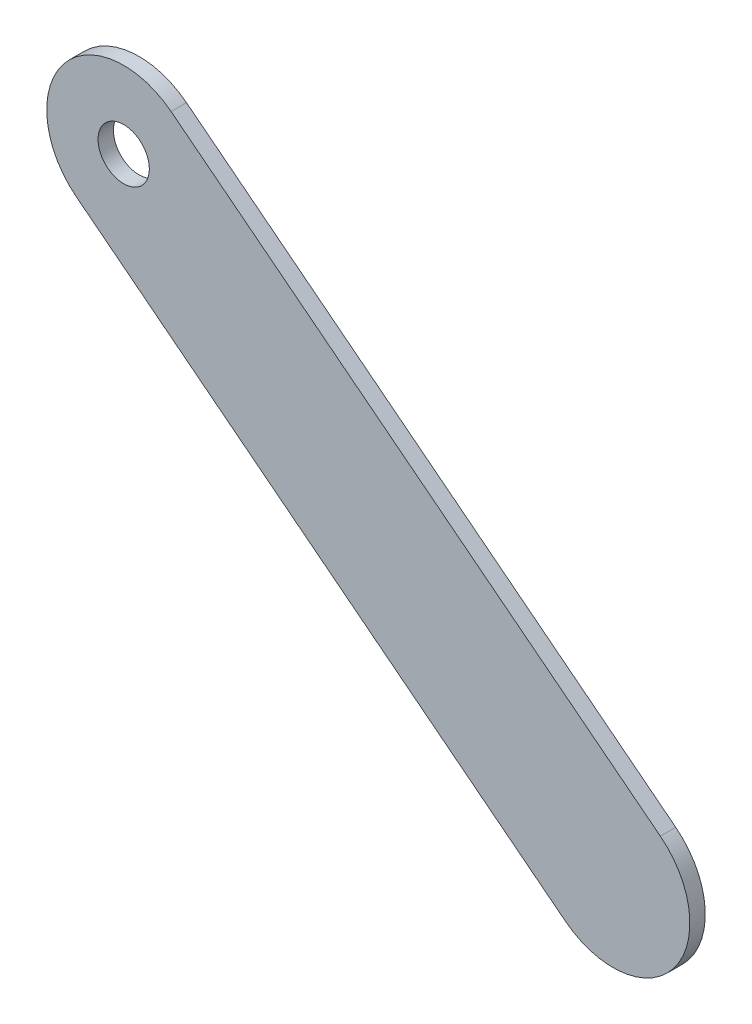
ISO-10303-21;
HEADER;
FILE_DESCRIPTION(('STEP AP214'),'2;1');
FILE_NAME('part.step','',(''),(''),'','','');
FILE_SCHEMA(('AUTOMOTIVE_DESIGN { 1 0 10303 214 1 1 1 1 }'));
ENDSEC;
DATA;
#1=APPLICATION_CONTEXT('core data for automotive mechanical design processes');
#2=APPLICATION_PROTOCOL_DEFINITION('international standard','automotive_design',2000,#1);
#3=PRODUCT_CONTEXT('',#1,'mechanical');
#4=PRODUCT('Part','Part','',(#3));
#5=PRODUCT_RELATED_PRODUCT_CATEGORY('part','',(#4));
#6=PRODUCT_DEFINITION_FORMATION('','',#4);
#7=PRODUCT_DEFINITION_CONTEXT('part definition',#1,'design');
#8=PRODUCT_DEFINITION('design','',#6,#7);
#9=PRODUCT_DEFINITION_SHAPE('','',#8);
#10=(LENGTH_UNIT() NAMED_UNIT(*) SI_UNIT(.MILLI.,.METRE.));
#11=(NAMED_UNIT(*) PLANE_ANGLE_UNIT() SI_UNIT($,.RADIAN.));
#12=(NAMED_UNIT(*) SI_UNIT($,.STERADIAN.) SOLID_ANGLE_UNIT());
#13=UNCERTAINTY_MEASURE_WITH_UNIT(LENGTH_MEASURE(1.E-05),#10,'distance_accuracy_value','');
#14=(GEOMETRIC_REPRESENTATION_CONTEXT(3) GLOBAL_UNCERTAINTY_ASSIGNED_CONTEXT((#13)) GLOBAL_UNIT_ASSIGNED_CONTEXT((#10,
#11,#12)) REPRESENTATION_CONTEXT('',''));
#15=CARTESIAN_POINT('',(0.,0.,0.));
#16=DIRECTION('',(0.,0.,1.));
#17=DIRECTION('',(1.,0.,0.));
#18=AXIS2_PLACEMENT_3D('',#15,#16,#17);
#19=CARTESIAN_POINT('',(-95.3863974624524,74.6563150541683,1.5));
#20=DIRECTION('',(0.,0.,1.));
#21=DIRECTION('',(1.,0.,0.));
#22=AXIS2_PLACEMENT_3D('',#19,#20,#21);
#23=PLANE('',#22);
#24=CARTESIAN_POINT('',(-95.3863974624524,74.6563150541683,1.5));
#25=DIRECTION('',(0.,0.,1.));
#26=DIRECTION('',(1.,0.,0.));
#27=AXIS2_PLACEMENT_3D('',#24,#25,#26);
#28=CIRCLE('',#27,15.);
#29=CARTESIAN_POINT('',(-86.1413057702997,86.4685239756058,1.5));
#30=VERTEX_POINT('',#29);
#31=CARTESIAN_POINT('',(-104.631489154605,62.8441061327308,1.5));
#32=VERTEX_POINT('',#31);
#33=EDGE_CURVE('E86',#30,#32,#28,.T.);
#34=ORIENTED_EDGE('',*,*,#33,.T.);
#35=DIRECTION('',(0.787480594762502,-0.616339446143516,0.));
#36=VECTOR('',#35,1.);
#37=CARTESIAN_POINT('',(-104.631489154605,62.8441061327308,1.5));
#38=LINE('',#37,#36);
#39=CARTESIAN_POINT('',(-9.24509169215274,-11.8122089214375,1.5));
#40=VERTEX_POINT('',#39);
#41=EDGE_CURVE('E81',#32,#40,#38,.T.);
#42=ORIENTED_EDGE('',*,*,#41,.T.);
#43=CARTESIAN_POINT('',(0.,0.,1.5));
#44=DIRECTION('',(0.,0.,1.));
#45=DIRECTION('',(1.,0.,0.));
#46=AXIS2_PLACEMENT_3D('',#43,#44,#45);
#47=CIRCLE('',#46,15.);
#48=CARTESIAN_POINT('',(9.24509169215272,11.8122089214375,1.5));
#49=VERTEX_POINT('',#48);
#50=EDGE_CURVE('E84',#40,#49,#47,.T.);
#51=ORIENTED_EDGE('',*,*,#50,.T.);
#52=DIRECTION('',(-0.787480594762502,0.616339446143516,0.));
#53=VECTOR('',#52,1.);
#54=CARTESIAN_POINT('',(-86.1413057702997,86.4685239756058,1.5));
#55=LINE('',#54,#53);
#56=EDGE_CURVE('E51',#49,#30,#55,.T.);
#57=ORIENTED_EDGE('',*,*,#56,.T.);
#58=EDGE_LOOP('',(#34,#42,#51,#57));
#59=FACE_BOUND('',#58,.T.);
#60=CARTESIAN_POINT('',(-95.3863974624524,74.6563150541683,1.5));
#61=DIRECTION('',(0.,0.,1.));
#62=DIRECTION('',(1.,0.,0.));
#63=AXIS2_PLACEMENT_3D('',#60,#61,#62);
#64=CIRCLE('',#63,4.99999999999999);
#65=CARTESIAN_POINT('',(-90.3863974624524,74.6563150541683,1.5));
#66=VERTEX_POINT('',#65);
#67=EDGE_CURVE('E101',#66,#66,#64,.T.);
#68=ORIENTED_EDGE('',*,*,#67,.F.);
#69=EDGE_LOOP('',(#68));
#70=FACE_BOUND('',#69,.T.);
#71=ADVANCED_FACE('F34',(#59,#70),#23,.T.);
#72=CARTESIAN_POINT('',(-95.3863974624524,74.6563150541683,-1.5));
#73=DIRECTION('',(0.,0.,1.));
#74=DIRECTION('',(1.,0.,0.));
#75=AXIS2_PLACEMENT_3D('',#72,#73,#74);
#76=PLANE('',#75);
#77=CARTESIAN_POINT('',(-95.3863974624524,74.6563150541683,-1.5));
#78=DIRECTION('',(0.,0.,1.));
#79=DIRECTION('',(1.,0.,0.));
#80=AXIS2_PLACEMENT_3D('',#77,#78,#79);
#81=CIRCLE('',#80,15.);
#82=CARTESIAN_POINT('',(-86.1413057702997,86.4685239756058,-1.5));
#83=VERTEX_POINT('',#82);
#84=CARTESIAN_POINT('',(-104.631489154605,62.8441061327308,-1.5));
#85=VERTEX_POINT('',#84);
#86=EDGE_CURVE('E98',#83,#85,#81,.T.);
#87=ORIENTED_EDGE('',*,*,#86,.F.);
#88=DIRECTION('',(-0.787480594762502,0.616339446143516,0.));
#89=VECTOR('',#88,1.);
#90=CARTESIAN_POINT('',(-86.1413057702997,86.4685239756058,-1.5));
#91=LINE('',#90,#89);
#92=CARTESIAN_POINT('',(9.24509169215272,11.8122089214375,-1.5));
#93=VERTEX_POINT('',#92);
#94=EDGE_CURVE('E74',#93,#83,#91,.T.);
#95=ORIENTED_EDGE('',*,*,#94,.F.);
#96=CARTESIAN_POINT('',(0.,0.,-1.5));
#97=DIRECTION('',(0.,0.,1.));
#98=DIRECTION('',(1.,0.,0.));
#99=AXIS2_PLACEMENT_3D('',#96,#97,#98);
#100=CIRCLE('',#99,15.);
#101=CARTESIAN_POINT('',(-9.24509169215274,-11.8122089214375,-1.5));
#102=VERTEX_POINT('',#101);
#103=EDGE_CURVE('E68',#102,#93,#100,.T.);
#104=ORIENTED_EDGE('',*,*,#103,.F.);
#105=DIRECTION('',(0.787480594762502,-0.616339446143516,0.));
#106=VECTOR('',#105,1.);
#107=CARTESIAN_POINT('',(-104.631489154605,62.8441061327308,-1.5));
#108=LINE('',#107,#106);
#109=EDGE_CURVE('E90',#85,#102,#108,.T.);
#110=ORIENTED_EDGE('',*,*,#109,.F.);
#111=EDGE_LOOP('',(#87,#95,#104,#110));
#112=FACE_BOUND('',#111,.T.);
#113=CARTESIAN_POINT('',(-95.3863974624524,74.6563150541683,-1.5));
#114=DIRECTION('',(0.,0.,1.));
#115=DIRECTION('',(1.,0.,0.));
#116=AXIS2_PLACEMENT_3D('',#113,#114,#115);
#117=CIRCLE('',#116,4.99999999999999);
#118=CARTESIAN_POINT('',(-90.3863974624524,74.6563150541683,-1.5));
#119=VERTEX_POINT('',#118);
#120=EDGE_CURVE('E113',#119,#119,#117,.T.);
#121=ORIENTED_EDGE('',*,*,#120,.T.);
#122=EDGE_LOOP('',(#121));
#123=FACE_BOUND('',#122,.T.);
#124=ADVANCED_FACE('F109',(#112,#123),#76,.F.);
#125=CARTESIAN_POINT('',(-95.3863974624524,74.6563150541683,1.5));
#126=DIRECTION('',(0.,0.,-1.));
#127=DIRECTION('',(-1.,0.,0.));
#128=AXIS2_PLACEMENT_3D('',#125,#126,#127);
#129=CYLINDRICAL_SURFACE('',#128,15.);
#130=ORIENTED_EDGE('',*,*,#86,.T.);
#131=DIRECTION('',(0.,0.,-1.));
#132=VECTOR('',#131,1.);
#133=CARTESIAN_POINT('',(-104.631489154605,62.8441061327308,1.5));
#134=LINE('',#133,#132);
#135=EDGE_CURVE('E11',#32,#85,#134,.T.);
#136=ORIENTED_EDGE('',*,*,#135,.F.);
#137=ORIENTED_EDGE('',*,*,#33,.F.);
#138=DIRECTION('',(0.,0.,-1.));
#139=VECTOR('',#138,1.);
#140=CARTESIAN_POINT('',(-86.1413057702997,86.4685239756058,1.5));
#141=LINE('',#140,#139);
#142=EDGE_CURVE('E94',#30,#83,#141,.T.);
#143=ORIENTED_EDGE('',*,*,#142,.T.);
#144=EDGE_LOOP('',(#130,#136,#137,#143));
#145=FACE_BOUND('',#144,.T.);
#146=ADVANCED_FACE('F36',(#145),#129,.T.);
#147=CARTESIAN_POINT('',(-104.631489154605,62.8441061327308,1.5));
#148=DIRECTION('',(0.616339446143516,0.787480594762502,0.));
#149=DIRECTION('',(-0.787480594762502,0.616339446143516,0.));
#150=AXIS2_PLACEMENT_3D('',#147,#148,#149);
#151=PLANE('',#150);
#152=ORIENTED_EDGE('',*,*,#109,.T.);
#153=DIRECTION('',(0.,0.,-1.));
#154=VECTOR('',#153,1.);
#155=CARTESIAN_POINT('',(-9.24509169215274,-11.8122089214375,1.5));
#156=LINE('',#155,#154);
#157=EDGE_CURVE('E43',#40,#102,#156,.T.);
#158=ORIENTED_EDGE('',*,*,#157,.F.);
#159=ORIENTED_EDGE('',*,*,#41,.F.);
#160=ORIENTED_EDGE('',*,*,#135,.T.);
#161=EDGE_LOOP('',(#152,#158,#159,#160));
#162=FACE_BOUND('',#161,.T.);
#163=ADVANCED_FACE('F89',(#162),#151,.F.);
#164=CARTESIAN_POINT('',(0.,0.,1.5));
#165=DIRECTION('',(0.,0.,-1.));
#166=DIRECTION('',(-1.,0.,0.));
#167=AXIS2_PLACEMENT_3D('',#164,#165,#166);
#168=CYLINDRICAL_SURFACE('',#167,15.);
#169=ORIENTED_EDGE('',*,*,#103,.T.);
#170=DIRECTION('',(0.,0.,-1.));
#171=VECTOR('',#170,1.);
#172=CARTESIAN_POINT('',(9.24509169215272,11.8122089214375,1.5));
#173=LINE('',#172,#171);
#174=EDGE_CURVE('E91',#49,#93,#173,.T.);
#175=ORIENTED_EDGE('',*,*,#174,.F.);
#176=ORIENTED_EDGE('',*,*,#50,.F.);
#177=ORIENTED_EDGE('',*,*,#157,.T.);
#178=EDGE_LOOP('',(#169,#175,#176,#177));
#179=FACE_BOUND('',#178,.T.);
#180=ADVANCED_FACE('F92',(#179),#168,.T.);
#181=CARTESIAN_POINT('',(-86.1413057702997,86.4685239756058,1.5));
#182=DIRECTION('',(-0.616339446143516,-0.787480594762502,0.));
#183=DIRECTION('',(0.787480594762502,-0.616339446143516,0.));
#184=AXIS2_PLACEMENT_3D('',#181,#182,#183);
#185=PLANE('',#184);
#186=ORIENTED_EDGE('',*,*,#94,.T.);
#187=ORIENTED_EDGE('',*,*,#142,.F.);
#188=ORIENTED_EDGE('',*,*,#56,.F.);
#189=ORIENTED_EDGE('',*,*,#174,.T.);
#190=EDGE_LOOP('',(#186,#187,#188,#189));
#191=FACE_BOUND('',#190,.T.);
#192=ADVANCED_FACE('F106',(#191),#185,.F.);
#193=CARTESIAN_POINT('',(-95.3863974624524,74.6563150541683,1.5));
#194=DIRECTION('',(0.,0.,-1.));
#195=DIRECTION('',(-1.,0.,0.));
#196=AXIS2_PLACEMENT_3D('',#193,#194,#195);
#197=CYLINDRICAL_SURFACE('',#196,4.99999999999999);
#198=ORIENTED_EDGE('',*,*,#67,.T.);
#199=EDGE_LOOP('',(#198));
#200=FACE_BOUND('',#199,.T.);
#201=ORIENTED_EDGE('',*,*,#120,.F.);
#202=EDGE_LOOP('',(#201));
#203=FACE_BOUND('',#202,.T.);
#204=ADVANCED_FACE('F119',(#200,#203),#197,.F.);
#205=CLOSED_SHELL('',(#71,#124,#146,#163,#180,#192,#204));
#206=MANIFOLD_SOLID_BREP('B2',#205);
#207=ADVANCED_BREP_SHAPE_REPRESENTATION('',(#18,#206),#14);
#208=SHAPE_DEFINITION_REPRESENTATION(#9,#207);
ENDSEC;
END-ISO-10303-21;
